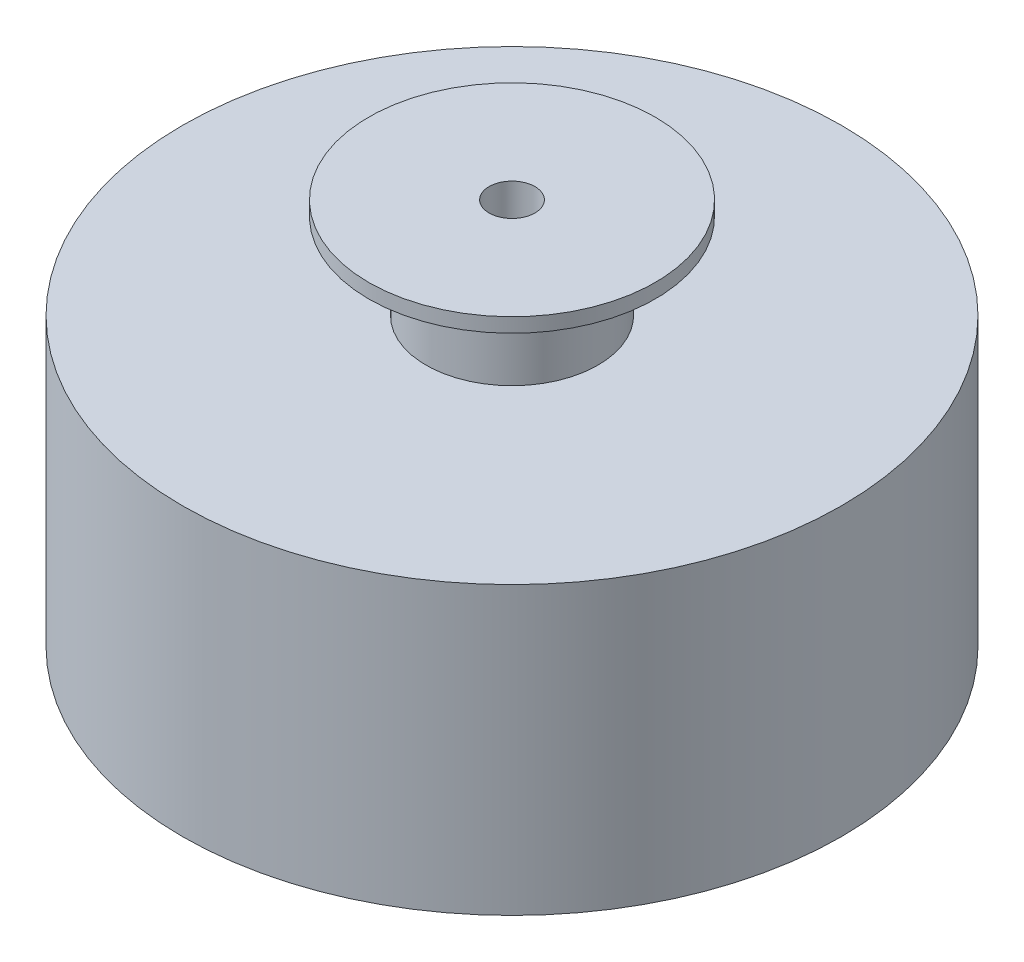
ISO-10303-21;
HEADER;
FILE_DESCRIPTION(('STEP AP214'),'2;1');
FILE_NAME('part.step','',(''),(''),'','','');
FILE_SCHEMA(('AUTOMOTIVE_DESIGN { 1 0 10303 214 1 1 1 1 }'));
ENDSEC;
DATA;
#1=APPLICATION_CONTEXT('core data for automotive mechanical design processes');
#2=APPLICATION_PROTOCOL_DEFINITION('international standard','automotive_design',2000,#1);
#3=PRODUCT_CONTEXT('',#1,'mechanical');
#4=PRODUCT('Part','Part','',(#3));
#5=PRODUCT_RELATED_PRODUCT_CATEGORY('part','',(#4));
#6=PRODUCT_DEFINITION_FORMATION('','',#4);
#7=PRODUCT_DEFINITION_CONTEXT('part definition',#1,'design');
#8=PRODUCT_DEFINITION('design','',#6,#7);
#9=PRODUCT_DEFINITION_SHAPE('','',#8);
#10=(LENGTH_UNIT() NAMED_UNIT(*) SI_UNIT(.MILLI.,.METRE.));
#11=(NAMED_UNIT(*) PLANE_ANGLE_UNIT() SI_UNIT($,.RADIAN.));
#12=(NAMED_UNIT(*) SI_UNIT($,.STERADIAN.) SOLID_ANGLE_UNIT());
#13=UNCERTAINTY_MEASURE_WITH_UNIT(LENGTH_MEASURE(1.E-05),#10,'distance_accuracy_value','');
#14=(GEOMETRIC_REPRESENTATION_CONTEXT(3) GLOBAL_UNCERTAINTY_ASSIGNED_CONTEXT((#13)) GLOBAL_UNIT_ASSIGNED_CONTEXT((#10,
#11,#12)) REPRESENTATION_CONTEXT('',''));
#15=CARTESIAN_POINT('',(0.,0.,0.));
#16=DIRECTION('',(0.,0.,1.));
#17=DIRECTION('',(1.,0.,0.));
#18=AXIS2_PLACEMENT_3D('',#15,#16,#17);
#19=CARTESIAN_POINT('',(0.,-50.0000000000002,115.));
#20=DIRECTION('',(0.,1.,0.));
#21=DIRECTION('',(0.,0.,1.));
#22=AXIS2_PLACEMENT_3D('',#19,#20,#21);
#23=PLANE('',#22);
#24=CARTESIAN_POINT('',(0.,-49.9999999999998,-1.71512449944286E-13));
#25=DIRECTION('',(0.,-1.,0.));
#26=DIRECTION('',(0.,0.,-1.));
#27=AXIS2_PLACEMENT_3D('',#24,#25,#26);
#28=CIRCLE('',#27,30.0000000000002);
#29=CARTESIAN_POINT('',(0.,-49.9999999999997,-30.0000000000003));
#30=VERTEX_POINT('',#29);
#31=EDGE_CURVE('E88',#30,#30,#28,.T.);
#32=ORIENTED_EDGE('',*,*,#31,.F.);
#33=EDGE_LOOP('',(#32));
#34=FACE_BOUND('',#33,.T.);
#35=CARTESIAN_POINT('',(0.,-49.9999999999998,-1.71512449944286E-13));
#36=DIRECTION('',(0.,-1.,0.));
#37=DIRECTION('',(0.,0.,-1.));
#38=AXIS2_PLACEMENT_3D('',#35,#36,#37);
#39=CIRCLE('',#38,115.);
#40=CARTESIAN_POINT('',(0.,-49.9999999999994,-115.));
#41=VERTEX_POINT('',#40);
#42=EDGE_CURVE('E10',#41,#41,#39,.T.);
#43=ORIENTED_EDGE('',*,*,#42,.T.);
#44=EDGE_LOOP('',(#43));
#45=FACE_BOUND('',#44,.T.);
#46=ADVANCED_FACE('F37',(#34,#45),#23,.F.);
#47=CARTESIAN_POINT('',(0.,-5577.83915172928,-1.91333771661652E-11));
#48=DIRECTION('',(0.,-1.,0.));
#49=DIRECTION('',(0.,0.,-1.));
#50=AXIS2_PLACEMENT_3D('',#47,#48,#49);
#51=CYLINDRICAL_SURFACE('',#50,115.);
#52=ORIENTED_EDGE('',*,*,#42,.F.);
#53=EDGE_LOOP('',(#52));
#54=FACE_BOUND('',#53,.T.);
#55=CARTESIAN_POINT('',(0.,49.9999999999998,1.71512449944289E-13));
#56=DIRECTION('',(0.,-1.,0.));
#57=DIRECTION('',(0.,0.,-1.));
#58=AXIS2_PLACEMENT_3D('',#55,#56,#57);
#59=CIRCLE('',#58,115.);
#60=CARTESIAN_POINT('',(0.,50.0000000000002,-115.));
#61=VERTEX_POINT('',#60);
#62=EDGE_CURVE('E44',#61,#61,#59,.T.);
#63=ORIENTED_EDGE('',*,*,#62,.T.);
#64=EDGE_LOOP('',(#63));
#65=FACE_BOUND('',#64,.T.);
#66=ADVANCED_FACE('F96',(#54,#65),#51,.T.);
#67=CARTESIAN_POINT('',(0.,50.0000000000001,30.));
#68=DIRECTION('',(0.,-1.,0.));
#69=DIRECTION('',(0.,0.,-1.));
#70=AXIS2_PLACEMENT_3D('',#67,#68,#69);
#71=PLANE('',#70);
#72=ORIENTED_EDGE('',*,*,#62,.F.);
#73=EDGE_LOOP('',(#72));
#74=FACE_BOUND('',#73,.T.);
#75=CARTESIAN_POINT('',(0.,49.9999999999998,1.71512449944289E-13));
#76=DIRECTION('',(0.,-1.,0.));
#77=DIRECTION('',(0.,0.,-1.));
#78=AXIS2_PLACEMENT_3D('',#75,#76,#77);
#79=CIRCLE('',#78,29.9999999999998);
#80=CARTESIAN_POINT('',(0.,49.9999999999999,-29.9999999999997));
#81=VERTEX_POINT('',#80);
#82=EDGE_CURVE('E49',#81,#81,#79,.T.);
#83=ORIENTED_EDGE('',*,*,#82,.T.);
#84=EDGE_LOOP('',(#83));
#85=FACE_BOUND('',#84,.T.);
#86=ADVANCED_FACE('F100',(#74,#85),#71,.F.);
#87=CARTESIAN_POINT('',(0.,-5577.83915172928,-1.91333771661652E-11));
#88=DIRECTION('',(0.,-1.,0.));
#89=DIRECTION('',(0.,0.,-1.));
#90=AXIS2_PLACEMENT_3D('',#87,#88,#89);
#91=CYLINDRICAL_SURFACE('',#90,29.9999999999998);
#92=ORIENTED_EDGE('',*,*,#82,.F.);
#93=EDGE_LOOP('',(#92));
#94=FACE_BOUND('',#93,.T.);
#95=CARTESIAN_POINT('',(0.,80.0000000000001,2.74419919910863E-13));
#96=DIRECTION('',(0.,-1.,0.));
#97=DIRECTION('',(0.,0.,-1.));
#98=AXIS2_PLACEMENT_3D('',#95,#96,#97);
#99=CIRCLE('',#98,29.9999999999997);
#100=CARTESIAN_POINT('',(0.,80.0000000000002,-29.9999999999994));
#101=VERTEX_POINT('',#100);
#102=EDGE_CURVE('E54',#101,#101,#99,.T.);
#103=ORIENTED_EDGE('',*,*,#102,.T.);
#104=EDGE_LOOP('',(#103));
#105=FACE_BOUND('',#104,.T.);
#106=ADVANCED_FACE('F105',(#94,#105),#91,.T.);
#107=CARTESIAN_POINT('',(0.,80.,30.));
#108=DIRECTION('',(0.,1.,0.));
#109=DIRECTION('',(0.,0.,1.));
#110=AXIS2_PLACEMENT_3D('',#107,#108,#109);
#111=PLANE('',#110);
#112=ORIENTED_EDGE('',*,*,#102,.F.);
#113=EDGE_LOOP('',(#112));
#114=FACE_BOUND('',#113,.T.);
#115=CARTESIAN_POINT('',(0.,80.0000000000001,2.74419919910863E-13));
#116=DIRECTION('',(0.,-1.,0.));
#117=DIRECTION('',(0.,0.,-1.));
#118=AXIS2_PLACEMENT_3D('',#115,#116,#117);
#119=CIRCLE('',#118,49.9999999999997);
#120=CARTESIAN_POINT('',(0.,80.0000000000002,-49.9999999999994));
#121=VERTEX_POINT('',#120);
#122=EDGE_CURVE('E60',#121,#121,#119,.T.);
#123=ORIENTED_EDGE('',*,*,#122,.T.);
#124=EDGE_LOOP('',(#123));
#125=FACE_BOUND('',#124,.T.);
#126=ADVANCED_FACE('F111',(#114,#125),#111,.F.);
#127=CARTESIAN_POINT('',(0.,-5577.83915172928,-1.91333771661652E-11));
#128=DIRECTION('',(0.,-1.,0.));
#129=DIRECTION('',(0.,0.,-1.));
#130=AXIS2_PLACEMENT_3D('',#127,#128,#129);
#131=CYLINDRICAL_SURFACE('',#130,49.9999999999997);
#132=ORIENTED_EDGE('',*,*,#122,.F.);
#133=EDGE_LOOP('',(#132));
#134=FACE_BOUND('',#133,.T.);
#135=CARTESIAN_POINT('',(0.,85.,2.91571164905291E-13));
#136=DIRECTION('',(0.,-1.,0.));
#137=DIRECTION('',(0.,0.,-1.));
#138=AXIS2_PLACEMENT_3D('',#135,#136,#137);
#139=CIRCLE('',#138,49.9999999999997);
#140=CARTESIAN_POINT('',(0.,85.0000000000001,-49.9999999999994));
#141=VERTEX_POINT('',#140);
#142=EDGE_CURVE('E64',#141,#141,#139,.T.);
#143=ORIENTED_EDGE('',*,*,#142,.T.);
#144=EDGE_LOOP('',(#143));
#145=FACE_BOUND('',#144,.T.);
#146=ADVANCED_FACE('F115',(#134,#145),#131,.T.);
#147=CARTESIAN_POINT('',(0.,84.9999999999999,50.));
#148=DIRECTION('',(0.,-1.,0.));
#149=DIRECTION('',(0.,0.,-1.));
#150=AXIS2_PLACEMENT_3D('',#147,#148,#149);
#151=PLANE('',#150);
#152=ORIENTED_EDGE('',*,*,#142,.F.);
#153=EDGE_LOOP('',(#152));
#154=FACE_BOUND('',#153,.T.);
#155=CARTESIAN_POINT('',(0.,85.,2.91571164905291E-13));
#156=DIRECTION('',(0.,-1.,0.));
#157=DIRECTION('',(0.,0.,-1.));
#158=AXIS2_PLACEMENT_3D('',#155,#156,#157);
#159=CIRCLE('',#158,7.99999999999973);
#160=CARTESIAN_POINT('',(0.,85.,-7.99999999999944));
#161=VERTEX_POINT('',#160);
#162=EDGE_CURVE('E68',#161,#161,#159,.T.);
#163=ORIENTED_EDGE('',*,*,#162,.T.);
#164=EDGE_LOOP('',(#163));
#165=FACE_BOUND('',#164,.T.);
#166=ADVANCED_FACE('F119',(#154,#165),#151,.F.);
#167=CARTESIAN_POINT('',(0.,-5577.83915172928,-1.91333771661652E-11));
#168=DIRECTION('',(0.,-1.,0.));
#169=DIRECTION('',(0.,0.,-1.));
#170=AXIS2_PLACEMENT_3D('',#167,#168,#169);
#171=CYLINDRICAL_SURFACE('',#170,8.00000000000001);
#172=ORIENTED_EDGE('',*,*,#162,.F.);
#173=EDGE_LOOP('',(#172));
#174=FACE_BOUND('',#173,.T.);
#175=CARTESIAN_POINT('',(0.,-85.,-2.91571164905288E-13));
#176=DIRECTION('',(0.,-1.,0.));
#177=DIRECTION('',(0.,0.,-1.));
#178=AXIS2_PLACEMENT_3D('',#175,#176,#177);
#179=CIRCLE('',#178,8.00000000000029);
#180=CARTESIAN_POINT('',(0.,-84.9999999999999,-8.00000000000058));
#181=VERTEX_POINT('',#180);
#182=EDGE_CURVE('E72',#181,#181,#179,.T.);
#183=ORIENTED_EDGE('',*,*,#182,.T.);
#184=EDGE_LOOP('',(#183));
#185=FACE_BOUND('',#184,.T.);
#186=ADVANCED_FACE('F123',(#174,#185),#171,.F.);
#187=CARTESIAN_POINT('',(0.,-85.0000000000001,50.));
#188=DIRECTION('',(0.,1.,0.));
#189=DIRECTION('',(0.,0.,1.));
#190=AXIS2_PLACEMENT_3D('',#187,#188,#189);
#191=PLANE('',#190);
#192=ORIENTED_EDGE('',*,*,#182,.F.);
#193=EDGE_LOOP('',(#192));
#194=FACE_BOUND('',#193,.T.);
#195=CARTESIAN_POINT('',(0.,-85.,-2.91571164905288E-13));
#196=DIRECTION('',(0.,-1.,0.));
#197=DIRECTION('',(0.,0.,-1.));
#198=AXIS2_PLACEMENT_3D('',#195,#196,#197);
#199=CIRCLE('',#198,50.0000000000003);
#200=CARTESIAN_POINT('',(0.,-84.9999999999998,-50.0000000000006));
#201=VERTEX_POINT('',#200);
#202=EDGE_CURVE('E76',#201,#201,#199,.T.);
#203=ORIENTED_EDGE('',*,*,#202,.T.);
#204=EDGE_LOOP('',(#203));
#205=FACE_BOUND('',#204,.T.);
#206=ADVANCED_FACE('F127',(#194,#205),#191,.F.);
#207=CARTESIAN_POINT('',(0.,-5577.83915172928,-1.91333771661652E-11));
#208=DIRECTION('',(0.,-1.,0.));
#209=DIRECTION('',(0.,0.,-1.));
#210=AXIS2_PLACEMENT_3D('',#207,#208,#209);
#211=CYLINDRICAL_SURFACE('',#210,50.0000000000003);
#212=ORIENTED_EDGE('',*,*,#202,.F.);
#213=EDGE_LOOP('',(#212));
#214=FACE_BOUND('',#213,.T.);
#215=CARTESIAN_POINT('',(0.,-80.0000000000001,-2.7441991991086E-13));
#216=DIRECTION('',(0.,-1.,0.));
#217=DIRECTION('',(0.,0.,-1.));
#218=AXIS2_PLACEMENT_3D('',#215,#216,#217);
#219=CIRCLE('',#218,50.0000000000003);
#220=CARTESIAN_POINT('',(0.,-79.9999999999999,-50.0000000000005));
#221=VERTEX_POINT('',#220);
#222=EDGE_CURVE('E80',#221,#221,#219,.T.);
#223=ORIENTED_EDGE('',*,*,#222,.T.);
#224=EDGE_LOOP('',(#223));
#225=FACE_BOUND('',#224,.T.);
#226=ADVANCED_FACE('F131',(#214,#225),#211,.T.);
#227=CARTESIAN_POINT('',(0.,-80.,30.));
#228=DIRECTION('',(0.,-1.,0.));
#229=DIRECTION('',(0.,0.,-1.));
#230=AXIS2_PLACEMENT_3D('',#227,#228,#229);
#231=PLANE('',#230);
#232=ORIENTED_EDGE('',*,*,#222,.F.);
#233=EDGE_LOOP('',(#232));
#234=FACE_BOUND('',#233,.T.);
#235=CARTESIAN_POINT('',(0.,-80.0000000000001,-2.7441991991086E-13));
#236=DIRECTION('',(0.,-1.,0.));
#237=DIRECTION('',(0.,0.,-1.));
#238=AXIS2_PLACEMENT_3D('',#235,#236,#237);
#239=CIRCLE('',#238,30.0000000000003);
#240=CARTESIAN_POINT('',(0.,-80.,-30.0000000000005));
#241=VERTEX_POINT('',#240);
#242=EDGE_CURVE('E84',#241,#241,#239,.T.);
#243=ORIENTED_EDGE('',*,*,#242,.T.);
#244=EDGE_LOOP('',(#243));
#245=FACE_BOUND('',#244,.T.);
#246=ADVANCED_FACE('F135',(#234,#245),#231,.F.);
#247=CARTESIAN_POINT('',(0.,-5577.83915172928,-1.91333771661652E-11));
#248=DIRECTION('',(0.,-1.,0.));
#249=DIRECTION('',(0.,0.,-1.));
#250=AXIS2_PLACEMENT_3D('',#247,#248,#249);
#251=CYLINDRICAL_SURFACE('',#250,30.0000000000002);
#252=ORIENTED_EDGE('',*,*,#242,.F.);
#253=EDGE_LOOP('',(#252));
#254=FACE_BOUND('',#253,.T.);
#255=ORIENTED_EDGE('',*,*,#31,.T.);
#256=EDGE_LOOP('',(#255));
#257=FACE_BOUND('',#256,.T.);
#258=ADVANCED_FACE('F93',(#254,#257),#251,.T.);
#259=CLOSED_SHELL('',(#46,#66,#86,#106,#126,#146,#166,#186,#206,#226,#246,#258));
#260=MANIFOLD_SOLID_BREP('B2',#259);
#261=ADVANCED_BREP_SHAPE_REPRESENTATION('',(#18,#260),#14);
#262=SHAPE_DEFINITION_REPRESENTATION(#9,#261);
ENDSEC;
END-ISO-10303-21;
